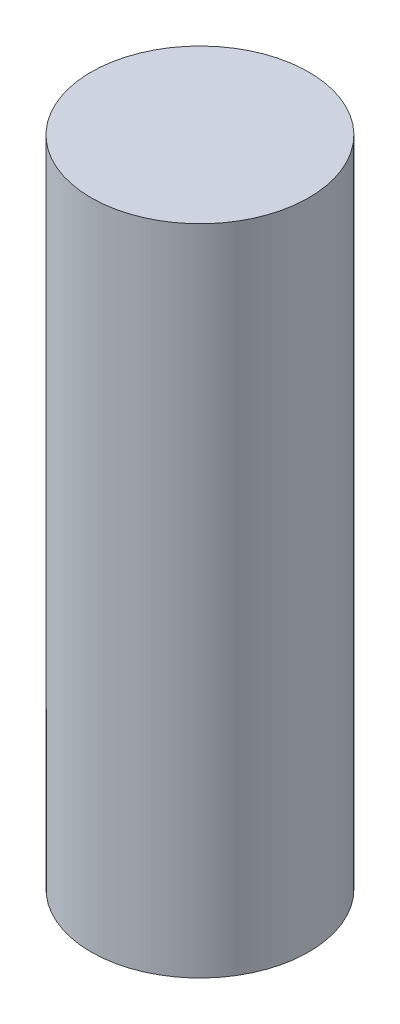
ISO-10303-21;
HEADER;
FILE_DESCRIPTION(('STEP AP214'),'2;1');
FILE_NAME('part.step','',(''),(''),'','','');
FILE_SCHEMA(('AUTOMOTIVE_DESIGN { 1 0 10303 214 1 1 1 1 }'));
ENDSEC;
DATA;
#1=APPLICATION_CONTEXT('core data for automotive mechanical design processes');
#2=APPLICATION_PROTOCOL_DEFINITION('international standard','automotive_design',2000,#1);
#3=PRODUCT_CONTEXT('',#1,'mechanical');
#4=PRODUCT('Part','Part','',(#3));
#5=PRODUCT_RELATED_PRODUCT_CATEGORY('part','',(#4));
#6=PRODUCT_DEFINITION_FORMATION('','',#4);
#7=PRODUCT_DEFINITION_CONTEXT('part definition',#1,'design');
#8=PRODUCT_DEFINITION('design','',#6,#7);
#9=PRODUCT_DEFINITION_SHAPE('','',#8);
#10=(LENGTH_UNIT() NAMED_UNIT(*) SI_UNIT(.MILLI.,.METRE.));
#11=(NAMED_UNIT(*) PLANE_ANGLE_UNIT() SI_UNIT($,.RADIAN.));
#12=(NAMED_UNIT(*) SI_UNIT($,.STERADIAN.) SOLID_ANGLE_UNIT());
#13=UNCERTAINTY_MEASURE_WITH_UNIT(LENGTH_MEASURE(1.E-05),#10,'distance_accuracy_value','');
#14=(GEOMETRIC_REPRESENTATION_CONTEXT(3) GLOBAL_UNCERTAINTY_ASSIGNED_CONTEXT((#13)) GLOBAL_UNIT_ASSIGNED_CONTEXT((#10,
#11,#12)) REPRESENTATION_CONTEXT('',''));
#15=CARTESIAN_POINT('',(0.,0.,0.));
#16=DIRECTION('',(0.,0.,1.));
#17=DIRECTION('',(1.,0.,0.));
#18=AXIS2_PLACEMENT_3D('',#15,#16,#17);
#19=CARTESIAN_POINT('',(0.,150.,0.));
#20=DIRECTION('',(0.,-1.,0.));
#21=DIRECTION('',(0.,0.,-1.));
#22=AXIS2_PLACEMENT_3D('',#19,#20,#21);
#23=CYLINDRICAL_SURFACE('',#22,25.);
#24=CARTESIAN_POINT('',(0.,150.,0.));
#25=DIRECTION('',(0.,1.,0.));
#26=DIRECTION('',(0.,0.,1.));
#27=AXIS2_PLACEMENT_3D('',#24,#25,#26);
#28=CIRCLE('',#27,25.);
#29=CARTESIAN_POINT('',(0.,150.,25.));
#30=VERTEX_POINT('',#29);
#31=EDGE_CURVE('E10',#30,#30,#28,.T.);
#32=ORIENTED_EDGE('',*,*,#31,.F.);
#33=EDGE_LOOP('',(#32));
#34=FACE_BOUND('',#33,.T.);
#35=CARTESIAN_POINT('',(0.,0.,0.));
#36=DIRECTION('',(0.,1.,0.));
#37=DIRECTION('',(0.,0.,1.));
#38=AXIS2_PLACEMENT_3D('',#35,#36,#37);
#39=CIRCLE('',#38,25.);
#40=CARTESIAN_POINT('',(0.,0.,25.));
#41=VERTEX_POINT('',#40);
#42=EDGE_CURVE('E42',#41,#41,#39,.T.);
#43=ORIENTED_EDGE('',*,*,#42,.T.);
#44=EDGE_LOOP('',(#43));
#45=FACE_BOUND('',#44,.T.);
#46=ADVANCED_FACE('F39',(#34,#45),#23,.T.);
#47=CARTESIAN_POINT('',(0.,150.,0.));
#48=DIRECTION('',(0.,1.,0.));
#49=DIRECTION('',(0.,0.,1.));
#50=AXIS2_PLACEMENT_3D('',#47,#48,#49);
#51=PLANE('',#50);
#52=ORIENTED_EDGE('',*,*,#31,.T.);
#53=EDGE_LOOP('',(#52));
#54=FACE_BOUND('',#53,.T.);
#55=ADVANCED_FACE('F54',(#54),#51,.T.);
#56=CARTESIAN_POINT('',(0.,0.,0.));
#57=DIRECTION('',(0.,1.,0.));
#58=DIRECTION('',(0.,0.,1.));
#59=AXIS2_PLACEMENT_3D('',#56,#57,#58);
#60=PLANE('',#59);
#61=ORIENTED_EDGE('',*,*,#42,.F.);
#62=EDGE_LOOP('',(#61));
#63=FACE_BOUND('',#62,.T.);
#64=ADVANCED_FACE('F52',(#63),#60,.F.);
#65=CLOSED_SHELL('',(#46,#55,#64));
#66=MANIFOLD_SOLID_BREP('B2',#65);
#67=ADVANCED_BREP_SHAPE_REPRESENTATION('',(#18,#66),#14);
#68=SHAPE_DEFINITION_REPRESENTATION(#9,#67);
ENDSEC;
END-ISO-10303-21;
